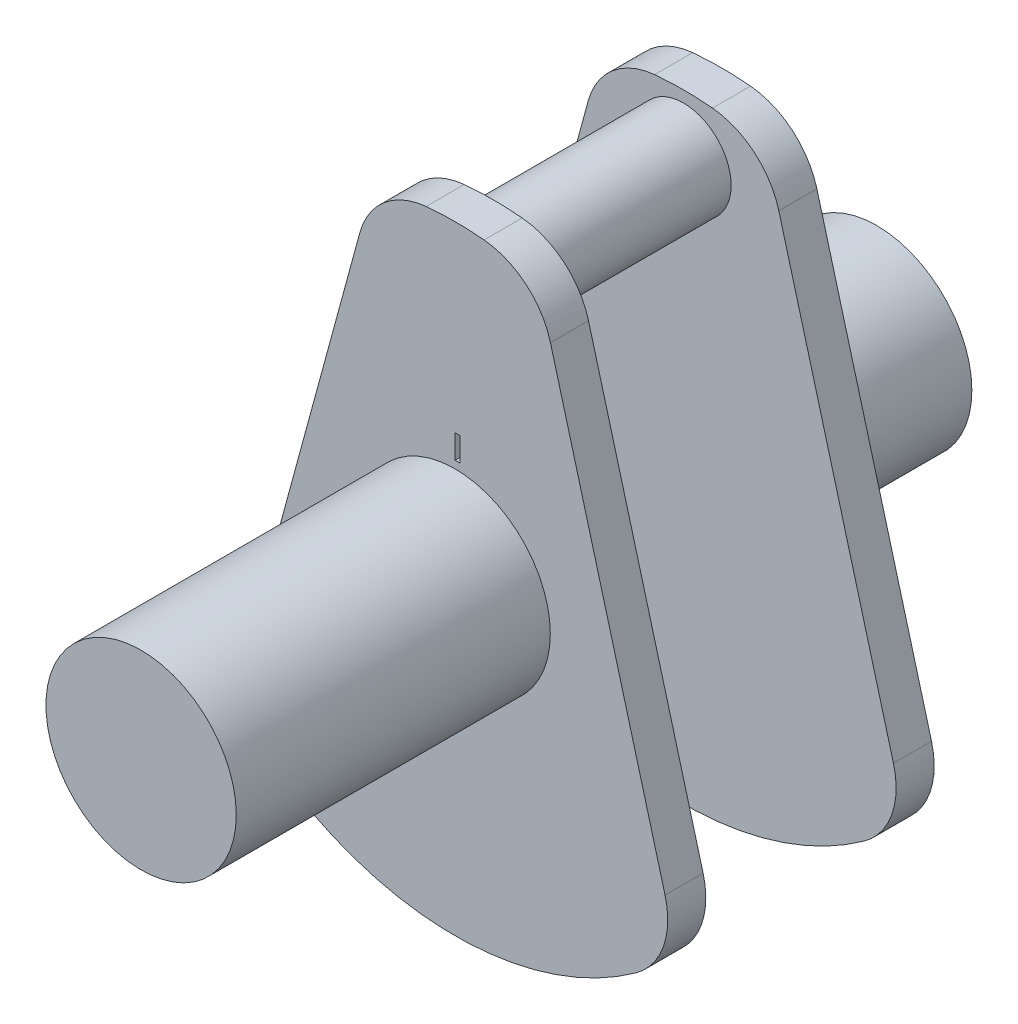
ISO-10303-21;
HEADER;
FILE_DESCRIPTION(('STEP AP214'),'2;1');
FILE_NAME('part.step','',(''),(''),'','','');
FILE_SCHEMA(('AUTOMOTIVE_DESIGN { 1 0 10303 214 1 1 1 1 }'));
ENDSEC;
DATA;
#1=APPLICATION_CONTEXT('core data for automotive mechanical design processes');
#2=APPLICATION_PROTOCOL_DEFINITION('international standard','automotive_design',2000,#1);
#3=PRODUCT_CONTEXT('',#1,'mechanical');
#4=PRODUCT('Part','Part','',(#3));
#5=PRODUCT_RELATED_PRODUCT_CATEGORY('part','',(#4));
#6=PRODUCT_DEFINITION_FORMATION('','',#4);
#7=PRODUCT_DEFINITION_CONTEXT('part definition',#1,'design');
#8=PRODUCT_DEFINITION('design','',#6,#7);
#9=PRODUCT_DEFINITION_SHAPE('','',#8);
#10=(LENGTH_UNIT() NAMED_UNIT(*) SI_UNIT(.MILLI.,.METRE.));
#11=(NAMED_UNIT(*) PLANE_ANGLE_UNIT() SI_UNIT($,.RADIAN.));
#12=(NAMED_UNIT(*) SI_UNIT($,.STERADIAN.) SOLID_ANGLE_UNIT());
#13=UNCERTAINTY_MEASURE_WITH_UNIT(LENGTH_MEASURE(1.E-05),#10,'distance_accuracy_value','');
#14=(GEOMETRIC_REPRESENTATION_CONTEXT(3) GLOBAL_UNCERTAINTY_ASSIGNED_CONTEXT((#13)) GLOBAL_UNIT_ASSIGNED_CONTEXT((#10,
#11,#12)) REPRESENTATION_CONTEXT('',''));
#15=CARTESIAN_POINT('',(0.,0.,0.));
#16=DIRECTION('',(0.,0.,1.));
#17=DIRECTION('',(1.,0.,0.));
#18=AXIS2_PLACEMENT_3D('',#15,#16,#17);
#19=CARTESIAN_POINT('',(11.6586,123.912746099988,20.32));
#20=DIRECTION('',(0.,0.,-1.));
#21=DIRECTION('',(-1.,0.,0.));
#22=AXIS2_PLACEMENT_3D('',#19,#20,#21);
#23=CYLINDRICAL_SURFACE('',#22,40.64);
#24=CARTESIAN_POINT('',(11.6586,123.912746099988,0.));
#25=DIRECTION('',(0.,0.,1.));
#26=DIRECTION('',(1.,0.,0.));
#27=AXIS2_PLACEMENT_3D('',#24,#25,#26);
#28=CIRCLE('',#27,40.64);
#29=CARTESIAN_POINT('',(50.8722173207385,134.585225503701,0.));
#30=VERTEX_POINT('',#29);
#31=CARTESIAN_POINT('',(15.4654897959183,164.374050948963,0.));
#32=VERTEX_POINT('',#31);
#33=EDGE_CURVE('E156',#30,#32,#28,.T.);
#34=ORIENTED_EDGE('',*,*,#33,.T.);
#35=DIRECTION('',(0.,0.,-1.));
#36=VECTOR('',#35,1.);
#37=CARTESIAN_POINT('',(15.4654897959183,164.374050948963,20.32));
#38=LINE('',#37,#36);
#39=CARTESIAN_POINT('',(15.4654897959183,164.374050948963,20.32));
#40=VERTEX_POINT('',#39);
#41=EDGE_CURVE('E50',#40,#32,#38,.T.);
#42=ORIENTED_EDGE('',*,*,#41,.F.);
#43=CARTESIAN_POINT('',(11.6586,123.912746099988,20.32));
#44=DIRECTION('',(0.,0.,1.));
#45=DIRECTION('',(1.,0.,0.));
#46=AXIS2_PLACEMENT_3D('',#43,#44,#45);
#47=CIRCLE('',#46,40.64);
#48=CARTESIAN_POINT('',(50.8722173207385,134.585225503701,20.32));
#49=VERTEX_POINT('',#48);
#50=EDGE_CURVE('E180',#49,#40,#47,.T.);
#51=ORIENTED_EDGE('',*,*,#50,.F.);
#52=DIRECTION('',(0.,0.,-1.));
#53=VECTOR('',#52,1.);
#54=CARTESIAN_POINT('',(50.8722173207385,134.585225503701,20.32));
#55=LINE('',#54,#53);
#56=EDGE_CURVE('E152',#49,#30,#55,.T.);
#57=ORIENTED_EDGE('',*,*,#56,.T.);
#58=EDGE_LOOP('',(#34,#42,#51,#57));
#59=FACE_BOUND('',#58,.T.);
#60=ADVANCED_FACE('F42',(#59),#23,.T.);
#61=CARTESIAN_POINT('',(0.,0.,20.32));
#62=DIRECTION('',(0.,0.,-1.));
#63=DIRECTION('',(-1.,0.,0.));
#64=AXIS2_PLACEMENT_3D('',#61,#62,#63);
#65=CYLINDRICAL_SURFACE('',#64,165.1);
#66=CARTESIAN_POINT('',(0.,0.,0.));
#67=DIRECTION('',(0.,0.,1.));
#68=DIRECTION('',(1.,0.,0.));
#69=AXIS2_PLACEMENT_3D('',#66,#67,#68);
#70=CIRCLE('',#69,165.1);
#71=CARTESIAN_POINT('',(-15.4654897959183,164.374050948963,0.));
#72=VERTEX_POINT('',#71);
#73=EDGE_CURVE('E160',#32,#72,#70,.T.);
#74=ORIENTED_EDGE('',*,*,#73,.T.);
#75=DIRECTION('',(0.,0.,-1.));
#76=VECTOR('',#75,1.);
#77=CARTESIAN_POINT('',(-15.4654897959183,164.374050948963,20.32));
#78=LINE('',#77,#76);
#79=CARTESIAN_POINT('',(-15.4654897959183,164.374050948963,20.32));
#80=VERTEX_POINT('',#79);
#81=EDGE_CURVE('E195',#80,#72,#78,.T.);
#82=ORIENTED_EDGE('',*,*,#81,.F.);
#83=CARTESIAN_POINT('',(0.,0.,20.32));
#84=DIRECTION('',(0.,0.,1.));
#85=DIRECTION('',(1.,0.,0.));
#86=AXIS2_PLACEMENT_3D('',#83,#84,#85);
#87=CIRCLE('',#86,165.1);
#88=EDGE_CURVE('E108',#40,#80,#87,.T.);
#89=ORIENTED_EDGE('',*,*,#88,.F.);
#90=ORIENTED_EDGE('',*,*,#41,.T.);
#91=EDGE_LOOP('',(#74,#82,#89,#90));
#92=FACE_BOUND('',#91,.T.);
#93=ADVANCED_FACE('F200',(#92),#65,.T.);
#94=CARTESIAN_POINT('',(-11.6586,123.912746099988,20.32));
#95=DIRECTION('',(0.,0.,-1.));
#96=DIRECTION('',(-1.,0.,0.));
#97=AXIS2_PLACEMENT_3D('',#94,#95,#96);
#98=CYLINDRICAL_SURFACE('',#97,40.64);
#99=CARTESIAN_POINT('',(-11.6586,123.912746099988,0.));
#100=DIRECTION('',(0.,0.,1.));
#101=DIRECTION('',(-1.,0.,0.));
#102=AXIS2_PLACEMENT_3D('',#99,#100,#101);
#103=CIRCLE('',#102,40.64);
#104=CARTESIAN_POINT('',(-50.8722173207385,134.585225503701,0.));
#105=VERTEX_POINT('',#104);
#106=EDGE_CURVE('E164',#72,#105,#103,.T.);
#107=ORIENTED_EDGE('',*,*,#106,.T.);
#108=DIRECTION('',(0.,0.,-1.));
#109=VECTOR('',#108,1.);
#110=CARTESIAN_POINT('',(-50.8722173207385,134.585225503701,20.32));
#111=LINE('',#110,#109);
#112=CARTESIAN_POINT('',(-50.8722173207385,134.585225503701,20.32));
#113=VERTEX_POINT('',#112);
#114=EDGE_CURVE('E191',#113,#105,#111,.T.);
#115=ORIENTED_EDGE('',*,*,#114,.F.);
#116=CARTESIAN_POINT('',(-11.6586,123.912746099988,20.32));
#117=DIRECTION('',(0.,0.,1.));
#118=DIRECTION('',(-1.,0.,0.));
#119=AXIS2_PLACEMENT_3D('',#116,#117,#118);
#120=CIRCLE('',#119,40.64);
#121=EDGE_CURVE('E219',#80,#113,#120,.T.);
#122=ORIENTED_EDGE('',*,*,#121,.F.);
#123=ORIENTED_EDGE('',*,*,#81,.T.);
#124=EDGE_LOOP('',(#107,#115,#122,#123));
#125=FACE_BOUND('',#124,.T.);
#126=ADVANCED_FACE('F211',(#125),#98,.T.);
#127=CARTESIAN_POINT('',(-50.8722173207385,134.585225503701,20.32));
#128=DIRECTION('',(0.964902001002423,-0.26261022154806,0.));
#129=DIRECTION('',(0.26261022154806,0.964902001002423,0.));
#130=AXIS2_PLACEMENT_3D('',#127,#128,#129);
#131=PLANE('',#130);
#132=DIRECTION('',(-0.26261022154806,-0.964902001002423,0.));
#133=VECTOR('',#132,1.);
#134=CARTESIAN_POINT('',(-50.8722173207385,134.585225503701,0.));
#135=LINE('',#134,#133);
#136=CARTESIAN_POINT('',(-112.061443674565,-90.2407793659986,0.));
#137=VERTEX_POINT('',#136);
#138=EDGE_CURVE('E167',#105,#137,#135,.T.);
#139=ORIENTED_EDGE('',*,*,#138,.T.);
#140=DIRECTION('',(0.,0.,-1.));
#141=VECTOR('',#140,1.);
#142=CARTESIAN_POINT('',(-112.061443674565,-90.2407793659986,20.32));
#143=LINE('',#142,#141);
#144=CARTESIAN_POINT('',(-112.061443674565,-90.2407793659986,20.32));
#145=VERTEX_POINT('',#144);
#146=EDGE_CURVE('E187',#145,#137,#143,.T.);
#147=ORIENTED_EDGE('',*,*,#146,.F.);
#148=DIRECTION('',(-0.26261022154806,-0.964902001002423,0.));
#149=VECTOR('',#148,1.);
#150=CARTESIAN_POINT('',(-50.8722173207385,134.585225503701,20.32));
#151=LINE('',#150,#149);
#152=EDGE_CURVE('E217',#113,#145,#151,.T.);
#153=ORIENTED_EDGE('',*,*,#152,.F.);
#154=ORIENTED_EDGE('',*,*,#114,.T.);
#155=EDGE_LOOP('',(#139,#147,#153,#154));
#156=FACE_BOUND('',#155,.T.);
#157=ADVANCED_FACE('F215',(#156),#131,.F.);
#158=CARTESIAN_POINT('',(-72.8478263538261,-100.913258769712,20.32));
#159=DIRECTION('',(0.,0.,-1.));
#160=DIRECTION('',(-1.,0.,0.));
#161=AXIS2_PLACEMENT_3D('',#158,#159,#160);
#162=CYLINDRICAL_SURFACE('',#161,40.64);
#163=CARTESIAN_POINT('',(-72.8478263538261,-100.913258769712,0.));
#164=DIRECTION('',(0.,0.,1.));
#165=DIRECTION('',(1.,0.,0.));
#166=AXIS2_PLACEMENT_3D('',#163,#164,#165);
#167=CIRCLE('',#166,40.64);
#168=CARTESIAN_POINT('',(-96.634871693851,-133.864526939413,0.));
#169=VERTEX_POINT('',#168);
#170=EDGE_CURVE('E170',#137,#169,#167,.T.);
#171=ORIENTED_EDGE('',*,*,#170,.T.);
#172=DIRECTION('',(0.,0.,-1.));
#173=VECTOR('',#172,1.);
#174=CARTESIAN_POINT('',(-96.634871693851,-133.864526939413,20.32));
#175=LINE('',#174,#173);
#176=CARTESIAN_POINT('',(-96.634871693851,-133.864526939413,20.32));
#177=VERTEX_POINT('',#176);
#178=EDGE_CURVE('E145',#177,#169,#175,.T.);
#179=ORIENTED_EDGE('',*,*,#178,.F.);
#180=CARTESIAN_POINT('',(-72.8478263538261,-100.913258769712,20.32));
#181=DIRECTION('',(0.,0.,1.));
#182=DIRECTION('',(1.,0.,0.));
#183=AXIS2_PLACEMENT_3D('',#180,#181,#182);
#184=CIRCLE('',#183,40.64);
#185=EDGE_CURVE('E131',#145,#177,#184,.T.);
#186=ORIENTED_EDGE('',*,*,#185,.F.);
#187=ORIENTED_EDGE('',*,*,#146,.T.);
#188=EDGE_LOOP('',(#171,#179,#186,#187));
#189=FACE_BOUND('',#188,.T.);
#190=ADVANCED_FACE('F506',(#189),#162,.T.);
#191=CARTESIAN_POINT('',(0.,0.,20.32));
#192=DIRECTION('',(0.,0.,-1.));
#193=DIRECTION('',(-1.,0.,0.));
#194=AXIS2_PLACEMENT_3D('',#191,#192,#193);
#195=CYLINDRICAL_SURFACE('',#194,165.1);
#196=CARTESIAN_POINT('',(0.,0.,0.));
#197=DIRECTION('',(0.,0.,1.));
#198=DIRECTION('',(1.,0.,0.));
#199=AXIS2_PLACEMENT_3D('',#196,#197,#198);
#200=CIRCLE('',#199,165.1);
#201=CARTESIAN_POINT('',(96.634871693851,-133.864526939413,0.));
#202=VERTEX_POINT('',#201);
#203=EDGE_CURVE('E141',#169,#202,#200,.T.);
#204=ORIENTED_EDGE('',*,*,#203,.T.);
#205=DIRECTION('',(0.,0.,-1.));
#206=VECTOR('',#205,1.);
#207=CARTESIAN_POINT('',(96.634871693851,-133.864526939413,20.32));
#208=LINE('',#207,#206);
#209=CARTESIAN_POINT('',(96.634871693851,-133.864526939413,20.32));
#210=VERTEX_POINT('',#209);
#211=EDGE_CURVE('E138',#210,#202,#208,.T.);
#212=ORIENTED_EDGE('',*,*,#211,.F.);
#213=CARTESIAN_POINT('',(0.,0.,20.32));
#214=DIRECTION('',(0.,0.,1.));
#215=DIRECTION('',(1.,0.,0.));
#216=AXIS2_PLACEMENT_3D('',#213,#214,#215);
#217=CIRCLE('',#216,165.1);
#218=EDGE_CURVE('E124',#177,#210,#217,.T.);
#219=ORIENTED_EDGE('',*,*,#218,.F.);
#220=ORIENTED_EDGE('',*,*,#178,.T.);
#221=EDGE_LOOP('',(#204,#212,#219,#220));
#222=FACE_BOUND('',#221,.T.);
#223=ADVANCED_FACE('F139',(#222),#195,.T.);
#224=CARTESIAN_POINT('',(72.8478263538261,-100.913258769712,20.32));
#225=DIRECTION('',(0.,0.,-1.));
#226=DIRECTION('',(-1.,0.,0.));
#227=AXIS2_PLACEMENT_3D('',#224,#225,#226);
#228=CYLINDRICAL_SURFACE('',#227,40.64);
#229=CARTESIAN_POINT('',(72.8478263538261,-100.913258769712,0.));
#230=DIRECTION('',(0.,0.,1.));
#231=DIRECTION('',(-1.,0.,0.));
#232=AXIS2_PLACEMENT_3D('',#229,#230,#231);
#233=CIRCLE('',#232,40.64);
#234=CARTESIAN_POINT('',(112.061443674565,-90.2407793659986,0.));
#235=VERTEX_POINT('',#234);
#236=EDGE_CURVE('E175',#202,#235,#233,.T.);
#237=ORIENTED_EDGE('',*,*,#236,.T.);
#238=DIRECTION('',(0.,0.,-1.));
#239=VECTOR('',#238,1.);
#240=CARTESIAN_POINT('',(112.061443674565,-90.2407793659986,20.32));
#241=LINE('',#240,#239);
#242=CARTESIAN_POINT('',(112.061443674565,-90.2407793659986,20.32));
#243=VERTEX_POINT('',#242);
#244=EDGE_CURVE('E146',#243,#235,#241,.T.);
#245=ORIENTED_EDGE('',*,*,#244,.F.);
#246=CARTESIAN_POINT('',(72.8478263538261,-100.913258769712,20.32));
#247=DIRECTION('',(0.,0.,1.));
#248=DIRECTION('',(-1.,0.,0.));
#249=AXIS2_PLACEMENT_3D('',#246,#247,#248);
#250=CIRCLE('',#249,40.64);
#251=EDGE_CURVE('E128',#210,#243,#250,.T.);
#252=ORIENTED_EDGE('',*,*,#251,.F.);
#253=ORIENTED_EDGE('',*,*,#211,.T.);
#254=EDGE_LOOP('',(#237,#245,#252,#253));
#255=FACE_BOUND('',#254,.T.);
#256=ADVANCED_FACE('F148',(#255),#228,.T.);
#257=CARTESIAN_POINT('',(50.8722173207385,134.585225503701,20.32));
#258=DIRECTION('',(-0.964902001002422,-0.26261022154806,0.));
#259=DIRECTION('',(0.26261022154806,-0.964902001002423,0.));
#260=AXIS2_PLACEMENT_3D('',#257,#258,#259);
#261=PLANE('',#260);
#262=DIRECTION('',(-0.26261022154806,0.964902001002422,0.));
#263=VECTOR('',#262,1.);
#264=CARTESIAN_POINT('',(50.8722173207385,134.585225503701,0.));
#265=LINE('',#264,#263);
#266=EDGE_CURVE('E99',#235,#30,#265,.T.);
#267=ORIENTED_EDGE('',*,*,#266,.T.);
#268=ORIENTED_EDGE('',*,*,#56,.F.);
#269=DIRECTION('',(-0.26261022154806,0.964902001002422,0.));
#270=VECTOR('',#269,1.);
#271=CARTESIAN_POINT('',(50.8722173207385,134.585225503701,20.32));
#272=LINE('',#271,#270);
#273=EDGE_CURVE('E66',#243,#49,#272,.T.);
#274=ORIENTED_EDGE('',*,*,#273,.F.);
#275=ORIENTED_EDGE('',*,*,#244,.T.);
#276=EDGE_LOOP('',(#267,#268,#274,#275));
#277=FACE_BOUND('',#276,.T.);
#278=ADVANCED_FACE('F514',(#277),#261,.F.);
#279=CARTESIAN_POINT('',(11.6586,123.912746099988,20.32));
#280=DIRECTION('',(0.,0.,1.));
#281=DIRECTION('',(1.,0.,0.));
#282=AXIS2_PLACEMENT_3D('',#279,#280,#281);
#283=PLANE('',#282);
#284=CARTESIAN_POINT('',(0.,133.5786,20.32));
#285=DIRECTION('',(0.,0.,1.));
#286=DIRECTION('',(1.,0.,0.));
#287=AXIS2_PLACEMENT_3D('',#284,#285,#286);
#288=CIRCLE('',#287,25.4);
#289=CARTESIAN_POINT('',(25.4,133.5786,20.32));
#290=VERTEX_POINT('',#289);
#291=EDGE_CURVE('E161',#290,#290,#288,.T.);
#292=ORIENTED_EDGE('',*,*,#291,.F.);
#293=EDGE_LOOP('',(#292));
#294=FACE_BOUND('',#293,.T.);
#295=ORIENTED_EDGE('',*,*,#50,.T.);
#296=ORIENTED_EDGE('',*,*,#88,.T.);
#297=ORIENTED_EDGE('',*,*,#121,.T.);
#298=ORIENTED_EDGE('',*,*,#152,.T.);
#299=ORIENTED_EDGE('',*,*,#185,.T.);
#300=ORIENTED_EDGE('',*,*,#218,.T.);
#301=ORIENTED_EDGE('',*,*,#251,.T.);
#302=ORIENTED_EDGE('',*,*,#273,.T.);
#303=EDGE_LOOP('',(#295,#296,#297,#298,#299,#300,#301,#302));
#304=FACE_BOUND('',#303,.T.);
#305=ADVANCED_FACE('F126',(#294,#304),#283,.T.);
#306=CARTESIAN_POINT('',(11.6586,123.912746099988,0.));
#307=DIRECTION('',(0.,0.,1.));
#308=DIRECTION('',(1.,0.,0.));
#309=AXIS2_PLACEMENT_3D('',#306,#307,#308);
#310=PLANE('',#309);
#311=CARTESIAN_POINT('',(0.,0.,0.));
#312=DIRECTION('',(0.,0.,1.));
#313=DIRECTION('',(1.,0.,0.));
#314=AXIS2_PLACEMENT_3D('',#311,#312,#313);
#315=CIRCLE('',#314,50.8);
#316=CARTESIAN_POINT('',(50.8,0.,0.));
#317=VERTEX_POINT('',#316);
#318=EDGE_CURVE('E11',#317,#317,#315,.F.);
#319=ORIENTED_EDGE('',*,*,#318,.F.);
#320=EDGE_LOOP('',(#319));
#321=FACE_BOUND('',#320,.T.);
#322=ORIENTED_EDGE('',*,*,#33,.F.);
#323=ORIENTED_EDGE('',*,*,#266,.F.);
#324=ORIENTED_EDGE('',*,*,#236,.F.);
#325=ORIENTED_EDGE('',*,*,#203,.F.);
#326=ORIENTED_EDGE('',*,*,#170,.F.);
#327=ORIENTED_EDGE('',*,*,#138,.F.);
#328=ORIENTED_EDGE('',*,*,#106,.F.);
#329=ORIENTED_EDGE('',*,*,#73,.F.);
#330=EDGE_LOOP('',(#322,#323,#324,#325,#326,#327,#328,#329));
#331=FACE_BOUND('',#330,.T.);
#332=ADVANCED_FACE('F205',(#321,#331),#310,.F.);
#333=CARTESIAN_POINT('',(0.,133.5786,71.12));
#334=DIRECTION('',(0.,0.,-1.));
#335=DIRECTION('',(-1.,0.,0.));
#336=AXIS2_PLACEMENT_3D('',#333,#334,#335);
#337=CYLINDRICAL_SURFACE('',#336,25.4);
#338=ORIENTED_EDGE('',*,*,#291,.T.);
#339=EDGE_LOOP('',(#338));
#340=FACE_BOUND('',#339,.T.);
#341=CARTESIAN_POINT('',(0.,133.5786,121.92));
#342=DIRECTION('',(0.,0.,1.));
#343=DIRECTION('',(1.,0.,0.));
#344=AXIS2_PLACEMENT_3D('',#341,#342,#343);
#345=CIRCLE('',#344,25.4);
#346=CARTESIAN_POINT('',(25.4,133.5786,121.92));
#347=VERTEX_POINT('',#346);
#348=EDGE_CURVE('E306',#347,#347,#345,.T.);
#349=ORIENTED_EDGE('',*,*,#348,.F.);
#350=EDGE_LOOP('',(#349));
#351=FACE_BOUND('',#350,.T.);
#352=ADVANCED_FACE('F519',(#340,#351),#337,.T.);
#353=CARTESIAN_POINT('',(0.,0.,-82.804));
#354=DIRECTION('',(0.,0.,1.));
#355=DIRECTION('',(1.,0.,0.));
#356=AXIS2_PLACEMENT_3D('',#353,#354,#355);
#357=CYLINDRICAL_SURFACE('',#356,50.8);
#358=CARTESIAN_POINT('',(0.,0.,-82.804));
#359=DIRECTION('',(0.,0.,-1.));
#360=DIRECTION('',(-1.,0.,0.));
#361=AXIS2_PLACEMENT_3D('',#358,#359,#360);
#362=CIRCLE('',#361,50.8);
#363=CARTESIAN_POINT('',(-50.8,0.,-82.804));
#364=VERTEX_POINT('',#363);
#365=EDGE_CURVE('E232',#364,#364,#362,.T.);
#366=ORIENTED_EDGE('',*,*,#365,.F.);
#367=EDGE_LOOP('',(#366));
#368=FACE_BOUND('',#367,.T.);
#369=ORIENTED_EDGE('',*,*,#318,.T.);
#370=EDGE_LOOP('',(#369));
#371=FACE_BOUND('',#370,.T.);
#372=ADVANCED_FACE('F526',(#368,#371),#357,.T.);
#373=CARTESIAN_POINT('',(0.,0.,-82.804));
#374=DIRECTION('',(0.,0.,-1.));
#375=DIRECTION('',(-1.,0.,0.));
#376=AXIS2_PLACEMENT_3D('',#373,#374,#375);
#377=PLANE('',#376);
#378=ORIENTED_EDGE('',*,*,#365,.T.);
#379=EDGE_LOOP('',(#378));
#380=FACE_BOUND('',#379,.T.);
#381=ADVANCED_FACE('F530',(#380),#377,.T.);
#382=CARTESIAN_POINT('',(11.6586,123.912746099988,121.92));
#383=DIRECTION('',(0.,0.,1.));
#384=DIRECTION('',(-1.,0.,0.));
#385=AXIS2_PLACEMENT_3D('',#382,#383,#384);
#386=CYLINDRICAL_SURFACE('',#385,40.64);
#387=CARTESIAN_POINT('',(11.6586,123.912746099988,142.24));
#388=DIRECTION('',(0.,0.,1.));
#389=DIRECTION('',(1.,0.,0.));
#390=AXIS2_PLACEMENT_3D('',#387,#388,#389);
#391=CIRCLE('',#390,40.64);
#392=CARTESIAN_POINT('',(50.8722173207385,134.585225503701,142.24));
#393=VERTEX_POINT('',#392);
#394=CARTESIAN_POINT('',(15.4654897959183,164.374050948963,142.24));
#395=VERTEX_POINT('',#394);
#396=EDGE_CURVE('E302',#393,#395,#391,.T.);
#397=ORIENTED_EDGE('',*,*,#396,.F.);
#398=DIRECTION('',(0.,0.,1.));
#399=VECTOR('',#398,1.);
#400=CARTESIAN_POINT('',(50.8722173207385,134.585225503701,121.92));
#401=LINE('',#400,#399);
#402=CARTESIAN_POINT('',(50.8722173207385,134.585225503701,121.92));
#403=VERTEX_POINT('',#402);
#404=EDGE_CURVE('E268',#403,#393,#401,.T.);
#405=ORIENTED_EDGE('',*,*,#404,.F.);
#406=CARTESIAN_POINT('',(11.6586,123.912746099988,121.92));
#407=DIRECTION('',(0.,0.,1.));
#408=DIRECTION('',(1.,0.,0.));
#409=AXIS2_PLACEMENT_3D('',#406,#407,#408);
#410=CIRCLE('',#409,40.64);
#411=CARTESIAN_POINT('',(15.4654897959183,164.374050948963,121.92));
#412=VERTEX_POINT('',#411);
#413=EDGE_CURVE('E277',#403,#412,#410,.T.);
#414=ORIENTED_EDGE('',*,*,#413,.T.);
#415=DIRECTION('',(0.,0.,1.));
#416=VECTOR('',#415,1.);
#417=CARTESIAN_POINT('',(15.4654897959183,164.374050948963,121.92));
#418=LINE('',#417,#416);
#419=EDGE_CURVE('E240',#412,#395,#418,.T.);
#420=ORIENTED_EDGE('',*,*,#419,.T.);
#421=EDGE_LOOP('',(#397,#405,#414,#420));
#422=FACE_BOUND('',#421,.T.);
#423=ADVANCED_FACE('F461',(#422),#386,.T.);
#424=CARTESIAN_POINT('',(0.,0.,121.92));
#425=DIRECTION('',(0.,0.,1.));
#426=DIRECTION('',(-1.,0.,0.));
#427=AXIS2_PLACEMENT_3D('',#424,#425,#426);
#428=CYLINDRICAL_SURFACE('',#427,165.1);
#429=CARTESIAN_POINT('',(0.,0.,142.24));
#430=DIRECTION('',(0.,0.,1.));
#431=DIRECTION('',(1.,0.,0.));
#432=AXIS2_PLACEMENT_3D('',#429,#430,#431);
#433=CIRCLE('',#432,165.1);
#434=CARTESIAN_POINT('',(-15.4654897959183,164.374050948963,142.24));
#435=VERTEX_POINT('',#434);
#436=EDGE_CURVE('E298',#395,#435,#433,.T.);
#437=ORIENTED_EDGE('',*,*,#436,.F.);
#438=ORIENTED_EDGE('',*,*,#419,.F.);
#439=CARTESIAN_POINT('',(0.,0.,121.92));
#440=DIRECTION('',(0.,0.,1.));
#441=DIRECTION('',(1.,0.,0.));
#442=AXIS2_PLACEMENT_3D('',#439,#440,#441);
#443=CIRCLE('',#442,165.1);
#444=CARTESIAN_POINT('',(-15.4654897959183,164.374050948963,121.92));
#445=VERTEX_POINT('',#444);
#446=EDGE_CURVE('E330',#412,#445,#443,.T.);
#447=ORIENTED_EDGE('',*,*,#446,.T.);
#448=DIRECTION('',(0.,0.,1.));
#449=VECTOR('',#448,1.);
#450=CARTESIAN_POINT('',(-15.4654897959183,164.374050948963,121.92));
#451=LINE('',#450,#449);
#452=EDGE_CURVE('E244',#445,#435,#451,.T.);
#453=ORIENTED_EDGE('',*,*,#452,.T.);
#454=EDGE_LOOP('',(#437,#438,#447,#453));
#455=FACE_BOUND('',#454,.T.);
#456=ADVANCED_FACE('F464',(#455),#428,.T.);
#457=CARTESIAN_POINT('',(-11.6586,123.912746099988,121.92));
#458=DIRECTION('',(0.,0.,1.));
#459=DIRECTION('',(-1.,0.,0.));
#460=AXIS2_PLACEMENT_3D('',#457,#458,#459);
#461=CYLINDRICAL_SURFACE('',#460,40.64);
#462=CARTESIAN_POINT('',(-11.6586,123.912746099988,142.24));
#463=DIRECTION('',(0.,0.,1.));
#464=DIRECTION('',(-1.,0.,0.));
#465=AXIS2_PLACEMENT_3D('',#462,#463,#464);
#466=CIRCLE('',#465,40.64);
#467=CARTESIAN_POINT('',(-50.8722173207385,134.585225503701,142.24));
#468=VERTEX_POINT('',#467);
#469=EDGE_CURVE('E294',#435,#468,#466,.T.);
#470=ORIENTED_EDGE('',*,*,#469,.F.);
#471=ORIENTED_EDGE('',*,*,#452,.F.);
#472=CARTESIAN_POINT('',(-11.6586,123.912746099988,121.92));
#473=DIRECTION('',(0.,0.,1.));
#474=DIRECTION('',(-1.,0.,0.));
#475=AXIS2_PLACEMENT_3D('',#472,#473,#474);
#476=CIRCLE('',#475,40.64);
#477=CARTESIAN_POINT('',(-50.8722173207385,134.585225503701,121.92));
#478=VERTEX_POINT('',#477);
#479=EDGE_CURVE('E326',#445,#478,#476,.T.);
#480=ORIENTED_EDGE('',*,*,#479,.T.);
#481=DIRECTION('',(0.,0.,1.));
#482=VECTOR('',#481,1.);
#483=CARTESIAN_POINT('',(-50.8722173207385,134.585225503701,121.92));
#484=LINE('',#483,#482);
#485=EDGE_CURVE('E248',#478,#468,#484,.T.);
#486=ORIENTED_EDGE('',*,*,#485,.T.);
#487=EDGE_LOOP('',(#470,#471,#480,#486));
#488=FACE_BOUND('',#487,.T.);
#489=ADVANCED_FACE('F467',(#488),#461,.T.);
#490=CARTESIAN_POINT('',(-50.8722173207385,134.585225503701,121.92));
#491=DIRECTION('',(0.964902001002423,-0.26261022154806,0.));
#492=DIRECTION('',(0.26261022154806,0.964902001002423,0.));
#493=AXIS2_PLACEMENT_3D('',#490,#491,#492);
#494=PLANE('',#493);
#495=DIRECTION('',(-0.26261022154806,-0.964902001002423,0.));
#496=VECTOR('',#495,1.);
#497=CARTESIAN_POINT('',(-50.8722173207385,134.585225503701,142.24));
#498=LINE('',#497,#496);
#499=CARTESIAN_POINT('',(-112.061443674565,-90.2407793659986,142.24));
#500=VERTEX_POINT('',#499);
#501=EDGE_CURVE('E290',#468,#500,#498,.T.);
#502=ORIENTED_EDGE('',*,*,#501,.F.);
#503=ORIENTED_EDGE('',*,*,#485,.F.);
#504=DIRECTION('',(-0.26261022154806,-0.964902001002423,0.));
#505=VECTOR('',#504,1.);
#506=CARTESIAN_POINT('',(-50.8722173207385,134.585225503701,121.92));
#507=LINE('',#506,#505);
#508=CARTESIAN_POINT('',(-112.061443674565,-90.2407793659986,121.92));
#509=VERTEX_POINT('',#508);
#510=EDGE_CURVE('E322',#478,#509,#507,.T.);
#511=ORIENTED_EDGE('',*,*,#510,.T.);
#512=DIRECTION('',(0.,0.,1.));
#513=VECTOR('',#512,1.);
#514=CARTESIAN_POINT('',(-112.061443674565,-90.2407793659986,121.92));
#515=LINE('',#514,#513);
#516=EDGE_CURVE('E252',#509,#500,#515,.T.);
#517=ORIENTED_EDGE('',*,*,#516,.T.);
#518=EDGE_LOOP('',(#502,#503,#511,#517));
#519=FACE_BOUND('',#518,.T.);
#520=ADVANCED_FACE('F470',(#519),#494,.F.);
#521=CARTESIAN_POINT('',(-72.8478263538261,-100.913258769712,121.92));
#522=DIRECTION('',(0.,0.,1.));
#523=DIRECTION('',(-1.,0.,0.));
#524=AXIS2_PLACEMENT_3D('',#521,#522,#523);
#525=CYLINDRICAL_SURFACE('',#524,40.64);
#526=CARTESIAN_POINT('',(-72.8478263538261,-100.913258769712,142.24));
#527=DIRECTION('',(0.,0.,1.));
#528=DIRECTION('',(1.,0.,0.));
#529=AXIS2_PLACEMENT_3D('',#526,#527,#528);
#530=CIRCLE('',#529,40.64);
#531=CARTESIAN_POINT('',(-96.634871693851,-133.864526939413,142.24));
#532=VERTEX_POINT('',#531);
#533=EDGE_CURVE('E286',#500,#532,#530,.T.);
#534=ORIENTED_EDGE('',*,*,#533,.F.);
#535=ORIENTED_EDGE('',*,*,#516,.F.);
#536=CARTESIAN_POINT('',(-72.8478263538261,-100.913258769712,121.92));
#537=DIRECTION('',(0.,0.,1.));
#538=DIRECTION('',(1.,0.,0.));
#539=AXIS2_PLACEMENT_3D('',#536,#537,#538);
#540=CIRCLE('',#539,40.64);
#541=CARTESIAN_POINT('',(-96.634871693851,-133.864526939413,121.92));
#542=VERTEX_POINT('',#541);
#543=EDGE_CURVE('E318',#509,#542,#540,.T.);
#544=ORIENTED_EDGE('',*,*,#543,.T.);
#545=DIRECTION('',(0.,0.,1.));
#546=VECTOR('',#545,1.);
#547=CARTESIAN_POINT('',(-96.634871693851,-133.864526939413,121.92));
#548=LINE('',#547,#546);
#549=EDGE_CURVE('E256',#542,#532,#548,.T.);
#550=ORIENTED_EDGE('',*,*,#549,.T.);
#551=EDGE_LOOP('',(#534,#535,#544,#550));
#552=FACE_BOUND('',#551,.T.);
#553=ADVANCED_FACE('F473',(#552),#525,.T.);
#554=CARTESIAN_POINT('',(0.,0.,121.92));
#555=DIRECTION('',(0.,0.,1.));
#556=DIRECTION('',(-1.,0.,0.));
#557=AXIS2_PLACEMENT_3D('',#554,#555,#556);
#558=CYLINDRICAL_SURFACE('',#557,165.1);
#559=CARTESIAN_POINT('',(0.,0.,142.24));
#560=DIRECTION('',(0.,0.,1.));
#561=DIRECTION('',(1.,0.,0.));
#562=AXIS2_PLACEMENT_3D('',#559,#560,#561);
#563=CIRCLE('',#562,165.1);
#564=CARTESIAN_POINT('',(96.634871693851,-133.864526939413,142.24));
#565=VERTEX_POINT('',#564);
#566=EDGE_CURVE('E282',#532,#565,#563,.T.);
#567=ORIENTED_EDGE('',*,*,#566,.F.);
#568=ORIENTED_EDGE('',*,*,#549,.F.);
#569=CARTESIAN_POINT('',(0.,0.,121.92));
#570=DIRECTION('',(0.,0.,1.));
#571=DIRECTION('',(1.,0.,0.));
#572=AXIS2_PLACEMENT_3D('',#569,#570,#571);
#573=CIRCLE('',#572,165.1);
#574=CARTESIAN_POINT('',(96.634871693851,-133.864526939413,121.92));
#575=VERTEX_POINT('',#574);
#576=EDGE_CURVE('E314',#542,#575,#573,.T.);
#577=ORIENTED_EDGE('',*,*,#576,.T.);
#578=DIRECTION('',(0.,0.,1.));
#579=VECTOR('',#578,1.);
#580=CARTESIAN_POINT('',(96.634871693851,-133.864526939413,121.92));
#581=LINE('',#580,#579);
#582=EDGE_CURVE('E260',#575,#565,#581,.T.);
#583=ORIENTED_EDGE('',*,*,#582,.T.);
#584=EDGE_LOOP('',(#567,#568,#577,#583));
#585=FACE_BOUND('',#584,.T.);
#586=ADVANCED_FACE('F476',(#585),#558,.T.);
#587=CARTESIAN_POINT('',(72.8478263538261,-100.913258769712,121.92));
#588=DIRECTION('',(0.,0.,1.));
#589=DIRECTION('',(-1.,0.,0.));
#590=AXIS2_PLACEMENT_3D('',#587,#588,#589);
#591=CYLINDRICAL_SURFACE('',#590,40.64);
#592=CARTESIAN_POINT('',(72.8478263538261,-100.913258769712,142.24));
#593=DIRECTION('',(0.,0.,1.));
#594=DIRECTION('',(-1.,0.,0.));
#595=AXIS2_PLACEMENT_3D('',#592,#593,#594);
#596=CIRCLE('',#595,40.64);
#597=CARTESIAN_POINT('',(112.061443674565,-90.2407793659986,142.24));
#598=VERTEX_POINT('',#597);
#599=EDGE_CURVE('E278',#565,#598,#596,.T.);
#600=ORIENTED_EDGE('',*,*,#599,.F.);
#601=ORIENTED_EDGE('',*,*,#582,.F.);
#602=CARTESIAN_POINT('',(72.8478263538261,-100.913258769712,121.92));
#603=DIRECTION('',(0.,0.,1.));
#604=DIRECTION('',(-1.,0.,0.));
#605=AXIS2_PLACEMENT_3D('',#602,#603,#604);
#606=CIRCLE('',#605,40.64);
#607=CARTESIAN_POINT('',(112.061443674565,-90.2407793659986,121.92));
#608=VERTEX_POINT('',#607);
#609=EDGE_CURVE('E310',#575,#608,#606,.T.);
#610=ORIENTED_EDGE('',*,*,#609,.T.);
#611=DIRECTION('',(0.,0.,1.));
#612=VECTOR('',#611,1.);
#613=CARTESIAN_POINT('',(112.061443674565,-90.2407793659986,121.92));
#614=LINE('',#613,#612);
#615=EDGE_CURVE('E264',#608,#598,#614,.T.);
#616=ORIENTED_EDGE('',*,*,#615,.T.);
#617=EDGE_LOOP('',(#600,#601,#610,#616));
#618=FACE_BOUND('',#617,.T.);
#619=ADVANCED_FACE('F479',(#618),#591,.T.);
#620=CARTESIAN_POINT('',(50.8722173207385,134.585225503701,121.92));
#621=DIRECTION('',(-0.964902001002422,-0.26261022154806,0.));
#622=DIRECTION('',(0.26261022154806,-0.964902001002423,0.));
#623=AXIS2_PLACEMENT_3D('',#620,#621,#622);
#624=PLANE('',#623);
#625=DIRECTION('',(-0.26261022154806,0.964902001002422,0.));
#626=VECTOR('',#625,1.);
#627=CARTESIAN_POINT('',(50.8722173207385,134.585225503701,142.24));
#628=LINE('',#627,#626);
#629=EDGE_CURVE('E273',#598,#393,#628,.T.);
#630=ORIENTED_EDGE('',*,*,#629,.F.);
#631=ORIENTED_EDGE('',*,*,#615,.F.);
#632=DIRECTION('',(-0.26261022154806,0.964902001002422,0.));
#633=VECTOR('',#632,1.);
#634=CARTESIAN_POINT('',(50.8722173207385,134.585225503701,121.92));
#635=LINE('',#634,#633);
#636=EDGE_CURVE('E272',#608,#403,#635,.T.);
#637=ORIENTED_EDGE('',*,*,#636,.T.);
#638=ORIENTED_EDGE('',*,*,#404,.T.);
#639=EDGE_LOOP('',(#630,#631,#637,#638));
#640=FACE_BOUND('',#639,.T.);
#641=ADVANCED_FACE('F458',(#640),#624,.F.);
#642=CARTESIAN_POINT('',(11.6586,123.912746099988,121.92));
#643=DIRECTION('',(0.,0.,-1.));
#644=DIRECTION('',(1.,0.,0.));
#645=AXIS2_PLACEMENT_3D('',#642,#643,#644);
#646=PLANE('',#645);
#647=ORIENTED_EDGE('',*,*,#348,.T.);
#648=EDGE_LOOP('',(#647));
#649=FACE_BOUND('',#648,.T.);
#650=ORIENTED_EDGE('',*,*,#413,.F.);
#651=ORIENTED_EDGE('',*,*,#636,.F.);
#652=ORIENTED_EDGE('',*,*,#609,.F.);
#653=ORIENTED_EDGE('',*,*,#576,.F.);
#654=ORIENTED_EDGE('',*,*,#543,.F.);
#655=ORIENTED_EDGE('',*,*,#510,.F.);
#656=ORIENTED_EDGE('',*,*,#479,.F.);
#657=ORIENTED_EDGE('',*,*,#446,.F.);
#658=EDGE_LOOP('',(#650,#651,#652,#653,#654,#655,#656,#657));
#659=FACE_BOUND('',#658,.T.);
#660=ADVANCED_FACE('F481',(#649,#659),#646,.T.);
#661=CARTESIAN_POINT('',(11.6586,123.912746099988,142.24));
#662=DIRECTION('',(0.,0.,-1.));
#663=DIRECTION('',(1.,0.,0.));
#664=AXIS2_PLACEMENT_3D('',#661,#662,#663);
#665=PLANE('',#664);
#666=DIRECTION('',(1.,0.,0.));
#667=VECTOR('',#666,1.);
#668=CARTESIAN_POINT('',(0.,54.7986564960851,142.24));
#669=LINE('',#668,#667);
#670=CARTESIAN_POINT('',(0.,54.7986564960851,142.24));
#671=VERTEX_POINT('',#670);
#672=CARTESIAN_POINT('',(2.54,54.7986564960851,142.24));
#673=VERTEX_POINT('',#672);
#674=EDGE_CURVE('E368',#671,#673,#669,.T.);
#675=ORIENTED_EDGE('',*,*,#674,.F.);
#676=DIRECTION('',(0.,-1.,0.));
#677=VECTOR('',#676,1.);
#678=CARTESIAN_POINT('',(0.,67.4986564960851,142.24));
#679=LINE('',#678,#677);
#680=CARTESIAN_POINT('',(0.,67.4986564960851,142.24));
#681=VERTEX_POINT('',#680);
#682=EDGE_CURVE('E57',#681,#671,#679,.T.);
#683=ORIENTED_EDGE('',*,*,#682,.F.);
#684=DIRECTION('',(-1.,0.,0.));
#685=VECTOR('',#684,1.);
#686=CARTESIAN_POINT('',(0.,67.4986564960851,142.24));
#687=LINE('',#686,#685);
#688=CARTESIAN_POINT('',(2.54,67.4986564960851,142.24));
#689=VERTEX_POINT('',#688);
#690=EDGE_CURVE('E359',#689,#681,#687,.T.);
#691=ORIENTED_EDGE('',*,*,#690,.F.);
#692=DIRECTION('',(0.,1.,0.));
#693=VECTOR('',#692,1.);
#694=CARTESIAN_POINT('',(2.54,67.4986564960851,142.24));
#695=LINE('',#694,#693);
#696=EDGE_CURVE('E364',#673,#689,#695,.T.);
#697=ORIENTED_EDGE('',*,*,#696,.F.);
#698=EDGE_LOOP('',(#675,#683,#691,#697));
#699=FACE_BOUND('',#698,.T.);
#700=CARTESIAN_POINT('',(0.,0.,142.24));
#701=DIRECTION('',(0.,0.,1.));
#702=DIRECTION('',(1.,0.,0.));
#703=AXIS2_PLACEMENT_3D('',#700,#701,#702);
#704=CIRCLE('',#703,50.8);
#705=CARTESIAN_POINT('',(50.8,0.,142.24));
#706=VERTEX_POINT('',#705);
#707=EDGE_CURVE('E236',#706,#706,#704,.F.);
#708=ORIENTED_EDGE('',*,*,#707,.T.);
#709=EDGE_LOOP('',(#708));
#710=FACE_BOUND('',#709,.T.);
#711=ORIENTED_EDGE('',*,*,#396,.T.);
#712=ORIENTED_EDGE('',*,*,#436,.T.);
#713=ORIENTED_EDGE('',*,*,#469,.T.);
#714=ORIENTED_EDGE('',*,*,#501,.T.);
#715=ORIENTED_EDGE('',*,*,#533,.T.);
#716=ORIENTED_EDGE('',*,*,#566,.T.);
#717=ORIENTED_EDGE('',*,*,#599,.T.);
#718=ORIENTED_EDGE('',*,*,#629,.T.);
#719=EDGE_LOOP('',(#711,#712,#713,#714,#715,#716,#717,#718));
#720=FACE_BOUND('',#719,.T.);
#721=ADVANCED_FACE('F455',(#699,#710,#720),#665,.F.);
#722=CARTESIAN_POINT('',(0.,0.,225.044));
#723=DIRECTION('',(0.,0.,-1.));
#724=DIRECTION('',(1.,0.,0.));
#725=AXIS2_PLACEMENT_3D('',#722,#723,#724);
#726=CYLINDRICAL_SURFACE('',#725,50.8);
#727=ORIENTED_EDGE('',*,*,#707,.F.);
#728=EDGE_LOOP('',(#727));
#729=FACE_BOUND('',#728,.T.);
#730=CARTESIAN_POINT('',(0.,0.,309.88));
#731=DIRECTION('',(0.,0.,1.));
#732=DIRECTION('',(1.,0.,0.));
#733=AXIS2_PLACEMENT_3D('',#730,#731,#732);
#734=CIRCLE('',#733,50.8);
#735=CARTESIAN_POINT('',(50.8,0.,309.88));
#736=VERTEX_POINT('',#735);
#737=EDGE_CURVE('E340',#736,#736,#734,.T.);
#738=ORIENTED_EDGE('',*,*,#737,.F.);
#739=EDGE_LOOP('',(#738));
#740=FACE_BOUND('',#739,.T.);
#741=ADVANCED_FACE('F490',(#729,#740),#726,.T.);
#742=CARTESIAN_POINT('',(0.,0.,309.88));
#743=DIRECTION('',(0.,0.,1.));
#744=DIRECTION('',(1.,0.,0.));
#745=AXIS2_PLACEMENT_3D('',#742,#743,#744);
#746=PLANE('',#745);
#747=ORIENTED_EDGE('',*,*,#737,.T.);
#748=EDGE_LOOP('',(#747));
#749=FACE_BOUND('',#748,.T.);
#750=ADVANCED_FACE('F572',(#749),#746,.T.);
#751=CARTESIAN_POINT('',(0.,67.4986564960851,139.7));
#752=DIRECTION('',(-1.,0.,0.));
#753=DIRECTION('',(0.,-1.,0.));
#754=AXIS2_PLACEMENT_3D('',#751,#752,#753);
#755=PLANE('',#754);
#756=ORIENTED_EDGE('',*,*,#682,.T.);
#757=DIRECTION('',(0.,0.,1.));
#758=VECTOR('',#757,1.);
#759=CARTESIAN_POINT('',(0.,54.7986564960851,139.7));
#760=LINE('',#759,#758);
#761=CARTESIAN_POINT('',(0.,54.7986564960851,139.7));
#762=VERTEX_POINT('',#761);
#763=EDGE_CURVE('E345',#762,#671,#760,.T.);
#764=ORIENTED_EDGE('',*,*,#763,.F.);
#765=DIRECTION('',(0.,-1.,0.));
#766=VECTOR('',#765,1.);
#767=CARTESIAN_POINT('',(0.,67.4986564960851,139.7));
#768=LINE('',#767,#766);
#769=CARTESIAN_POINT('',(0.,67.4986564960851,139.7));
#770=VERTEX_POINT('',#769);
#771=EDGE_CURVE('E363',#770,#762,#768,.T.);
#772=ORIENTED_EDGE('',*,*,#771,.F.);
#773=DIRECTION('',(0.,0.,1.));
#774=VECTOR('',#773,1.);
#775=CARTESIAN_POINT('',(0.,67.4986564960851,139.7));
#776=LINE('',#775,#774);
#777=EDGE_CURVE('E344',#770,#681,#776,.T.);
#778=ORIENTED_EDGE('',*,*,#777,.T.);
#779=EDGE_LOOP('',(#756,#764,#772,#778));
#780=FACE_BOUND('',#779,.T.);
#781=ADVANCED_FACE('F397',(#780),#755,.F.);
#782=CARTESIAN_POINT('',(0.,67.4986564960851,139.7));
#783=DIRECTION('',(0.,1.,0.));
#784=DIRECTION('',(0.,0.,1.));
#785=AXIS2_PLACEMENT_3D('',#782,#783,#784);
#786=PLANE('',#785);
#787=ORIENTED_EDGE('',*,*,#690,.T.);
#788=ORIENTED_EDGE('',*,*,#777,.F.);
#789=DIRECTION('',(-1.,0.,0.));
#790=VECTOR('',#789,1.);
#791=CARTESIAN_POINT('',(0.,67.4986564960851,139.7));
#792=LINE('',#791,#790);
#793=CARTESIAN_POINT('',(2.54,67.4986564960851,139.7));
#794=VERTEX_POINT('',#793);
#795=EDGE_CURVE('E349',#794,#770,#792,.T.);
#796=ORIENTED_EDGE('',*,*,#795,.F.);
#797=DIRECTION('',(0.,0.,1.));
#798=VECTOR('',#797,1.);
#799=CARTESIAN_POINT('',(2.54,67.4986564960851,139.7));
#800=LINE('',#799,#798);
#801=EDGE_CURVE('E353',#794,#689,#800,.T.);
#802=ORIENTED_EDGE('',*,*,#801,.T.);
#803=EDGE_LOOP('',(#787,#788,#796,#802));
#804=FACE_BOUND('',#803,.T.);
#805=ADVANCED_FACE('F594',(#804),#786,.F.);
#806=CARTESIAN_POINT('',(2.54,67.4986564960851,139.7));
#807=DIRECTION('',(1.,0.,0.));
#808=DIRECTION('',(0.,1.,0.));
#809=AXIS2_PLACEMENT_3D('',#806,#807,#808);
#810=PLANE('',#809);
#811=ORIENTED_EDGE('',*,*,#696,.T.);
#812=ORIENTED_EDGE('',*,*,#801,.F.);
#813=DIRECTION('',(0.,1.,0.));
#814=VECTOR('',#813,1.);
#815=CARTESIAN_POINT('',(2.54,67.4986564960851,139.7));
#816=LINE('',#815,#814);
#817=CARTESIAN_POINT('',(2.54,54.7986564960851,139.7));
#818=VERTEX_POINT('',#817);
#819=EDGE_CURVE('E377',#818,#794,#816,.T.);
#820=ORIENTED_EDGE('',*,*,#819,.F.);
#821=DIRECTION('',(0.,0.,1.));
#822=VECTOR('',#821,1.);
#823=CARTESIAN_POINT('',(2.54,54.7986564960851,139.7));
#824=LINE('',#823,#822);
#825=EDGE_CURVE('E348',#818,#673,#824,.T.);
#826=ORIENTED_EDGE('',*,*,#825,.T.);
#827=EDGE_LOOP('',(#811,#812,#820,#826));
#828=FACE_BOUND('',#827,.T.);
#829=ADVANCED_FACE('F604',(#828),#810,.F.);
#830=CARTESIAN_POINT('',(0.,54.7986564960851,139.7));
#831=DIRECTION('',(0.,-1.,0.));
#832=DIRECTION('',(0.,0.,-1.));
#833=AXIS2_PLACEMENT_3D('',#830,#831,#832);
#834=PLANE('',#833);
#835=ORIENTED_EDGE('',*,*,#674,.T.);
#836=ORIENTED_EDGE('',*,*,#825,.F.);
#837=DIRECTION('',(1.,0.,0.));
#838=VECTOR('',#837,1.);
#839=CARTESIAN_POINT('',(0.,54.7986564960851,139.7));
#840=LINE('',#839,#838);
#841=EDGE_CURVE('E381',#762,#818,#840,.T.);
#842=ORIENTED_EDGE('',*,*,#841,.F.);
#843=ORIENTED_EDGE('',*,*,#763,.T.);
#844=EDGE_LOOP('',(#835,#836,#842,#843));
#845=FACE_BOUND('',#844,.T.);
#846=ADVANCED_FACE('F614',(#845),#834,.F.);
#847=CARTESIAN_POINT('',(0.,0.,139.7));
#848=DIRECTION('',(0.,0.,1.));
#849=DIRECTION('',(1.,0.,0.));
#850=AXIS2_PLACEMENT_3D('',#847,#848,#849);
#851=PLANE('',#850);
#852=ORIENTED_EDGE('',*,*,#771,.T.);
#853=ORIENTED_EDGE('',*,*,#841,.T.);
#854=ORIENTED_EDGE('',*,*,#819,.T.);
#855=ORIENTED_EDGE('',*,*,#795,.T.);
#856=EDGE_LOOP('',(#852,#853,#854,#855));
#857=FACE_BOUND('',#856,.T.);
#858=ADVANCED_FACE('F390',(#857),#851,.T.);
#859=CLOSED_SHELL('',(#60,#93,#126,#157,#190,#223,#256,#278,#305,#332,#352,#372,#381,#423,#456,
#489,#520,#553,#586,#619,#641,#660,#721,#741,#750,#781,#805,#829,#846,#858));
#860=MANIFOLD_SOLID_BREP('B2',#859);
#861=ADVANCED_BREP_SHAPE_REPRESENTATION('',(#18,#860),#14);
#862=SHAPE_DEFINITION_REPRESENTATION(#9,#861);
ENDSEC;
END-ISO-10303-21;
